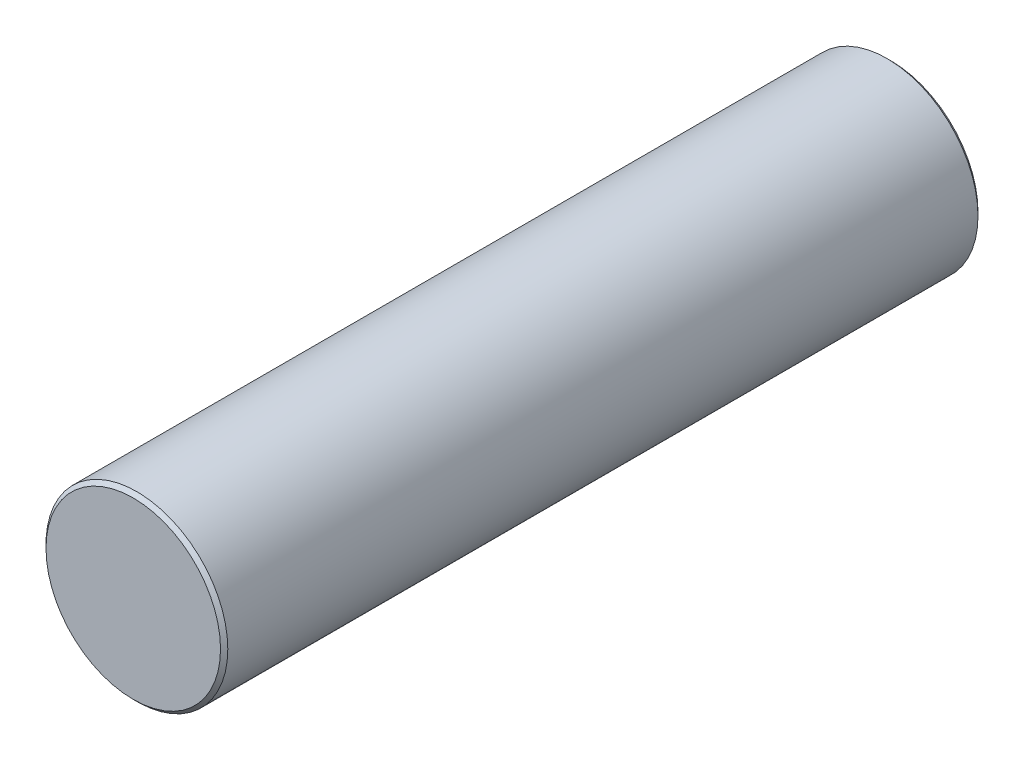
ISO-10303-21;
HEADER;
FILE_DESCRIPTION(('STEP AP214'),'2;1');
FILE_NAME('part.step','',(''),(''),'','','');
FILE_SCHEMA(('AUTOMOTIVE_DESIGN { 1 0 10303 214 1 1 1 1 }'));
ENDSEC;
DATA;
#1=APPLICATION_CONTEXT('core data for automotive mechanical design processes');
#2=APPLICATION_PROTOCOL_DEFINITION('international standard','automotive_design',2000,#1);
#3=PRODUCT_CONTEXT('',#1,'mechanical');
#4=PRODUCT('Part','Part','',(#3));
#5=PRODUCT_RELATED_PRODUCT_CATEGORY('part','',(#4));
#6=PRODUCT_DEFINITION_FORMATION('','',#4);
#7=PRODUCT_DEFINITION_CONTEXT('part definition',#1,'design');
#8=PRODUCT_DEFINITION('design','',#6,#7);
#9=PRODUCT_DEFINITION_SHAPE('','',#8);
#10=(LENGTH_UNIT() NAMED_UNIT(*) SI_UNIT(.MILLI.,.METRE.));
#11=(NAMED_UNIT(*) PLANE_ANGLE_UNIT() SI_UNIT($,.RADIAN.));
#12=(NAMED_UNIT(*) SI_UNIT($,.STERADIAN.) SOLID_ANGLE_UNIT());
#13=UNCERTAINTY_MEASURE_WITH_UNIT(LENGTH_MEASURE(1.E-05),#10,'distance_accuracy_value','');
#14=(GEOMETRIC_REPRESENTATION_CONTEXT(3) GLOBAL_UNCERTAINTY_ASSIGNED_CONTEXT((#13)) GLOBAL_UNIT_ASSIGNED_CONTEXT((#10,
#11,#12)) REPRESENTATION_CONTEXT('',''));
#15=CARTESIAN_POINT('',(0.,0.,0.));
#16=DIRECTION('',(0.,0.,1.));
#17=DIRECTION('',(1.,0.,0.));
#18=AXIS2_PLACEMENT_3D('',#15,#16,#17);
#19=CARTESIAN_POINT('',(0.,0.,12.5));
#20=DIRECTION('',(0.,0.,-1.));
#21=DIRECTION('',(-1.,0.,0.));
#22=AXIS2_PLACEMENT_3D('',#19,#20,#21);
#23=CYLINDRICAL_SURFACE('',#22,3.);
#24=CARTESIAN_POINT('',(0.,0.,-12.38));
#25=DIRECTION('',(0.,0.,1.));
#26=DIRECTION('',(1.,0.,0.));
#27=AXIS2_PLACEMENT_3D('',#24,#25,#26);
#28=CIRCLE('',#27,3.);
#29=CARTESIAN_POINT('',(3.,0.,-12.38));
#30=VERTEX_POINT('',#29);
#31=EDGE_CURVE('E53',#30,#30,#28,.T.);
#32=ORIENTED_EDGE('',*,*,#31,.T.);
#33=EDGE_LOOP('',(#32));
#34=FACE_BOUND('',#33,.T.);
#35=CARTESIAN_POINT('',(0.,0.,12.38));
#36=DIRECTION('',(0.,0.,1.));
#37=DIRECTION('',(1.,0.,0.));
#38=AXIS2_PLACEMENT_3D('',#35,#36,#37);
#39=CIRCLE('',#38,3.);
#40=CARTESIAN_POINT('',(3.,0.,12.38));
#41=VERTEX_POINT('',#40);
#42=EDGE_CURVE('E59',#41,#41,#39,.F.);
#43=ORIENTED_EDGE('',*,*,#42,.T.);
#44=EDGE_LOOP('',(#43));
#45=FACE_BOUND('',#44,.T.);
#46=ADVANCED_FACE('F39',(#34,#45),#23,.T.);
#47=CARTESIAN_POINT('',(0.,0.,12.5));
#48=DIRECTION('',(0.,0.,1.));
#49=DIRECTION('',(1.,0.,0.));
#50=AXIS2_PLACEMENT_3D('',#47,#48,#49);
#51=PLANE('',#50);
#52=CARTESIAN_POINT('',(0.,0.,12.5));
#53=DIRECTION('',(0.,0.,1.));
#54=DIRECTION('',(1.,0.,0.));
#55=AXIS2_PLACEMENT_3D('',#52,#53,#54);
#56=CIRCLE('',#55,2.88);
#57=CARTESIAN_POINT('',(2.88,0.,12.5));
#58=VERTEX_POINT('',#57);
#59=EDGE_CURVE('E10',#58,#58,#56,.T.);
#60=ORIENTED_EDGE('',*,*,#59,.T.);
#61=EDGE_LOOP('',(#60));
#62=FACE_BOUND('',#61,.T.);
#63=ADVANCED_FACE('F77',(#62),#51,.T.);
#64=CARTESIAN_POINT('',(0.,0.,-12.5));
#65=DIRECTION('',(0.,0.,1.));
#66=DIRECTION('',(1.,0.,0.));
#67=AXIS2_PLACEMENT_3D('',#64,#65,#66);
#68=PLANE('',#67);
#69=CARTESIAN_POINT('',(0.,0.,-12.5));
#70=DIRECTION('',(0.,0.,1.));
#71=DIRECTION('',(1.,0.,0.));
#72=AXIS2_PLACEMENT_3D('',#69,#70,#71);
#73=CIRCLE('',#72,2.88);
#74=CARTESIAN_POINT('',(2.88,0.,-12.5));
#75=VERTEX_POINT('',#74);
#76=EDGE_CURVE('E47',#75,#75,#73,.F.);
#77=ORIENTED_EDGE('',*,*,#76,.T.);
#78=EDGE_LOOP('',(#77));
#79=FACE_BOUND('',#78,.T.);
#80=ADVANCED_FACE('F74',(#79),#68,.F.);
#81=CARTESIAN_POINT('',(0.,0.,-12.38));
#82=DIRECTION('',(0.,0.,1.));
#83=DIRECTION('',(1.,0.,0.));
#84=AXIS2_PLACEMENT_3D('',#81,#82,#83);
#85=CONICAL_SURFACE('',#84,3.,0.785398163397434);
#86=CARTESIAN_POINT('',(2.88,0.,-12.5));
#87=CARTESIAN_POINT('',(2.88125,0.,-12.49875));
#88=CARTESIAN_POINT('',(2.8825,0.,-12.4975));
#89=CARTESIAN_POINT('',(2.885,0.,-12.495));
#90=CARTESIAN_POINT('',(2.88625,0.,-12.49375));
#91=CARTESIAN_POINT('',(2.88875,0.,-12.49125));
#92=CARTESIAN_POINT('',(2.89,0.,-12.49));
#93=CARTESIAN_POINT('',(2.8925,0.,-12.4875));
#94=CARTESIAN_POINT('',(2.89375,0.,-12.48625));
#95=CARTESIAN_POINT('',(2.89625,0.,-12.48375));
#96=CARTESIAN_POINT('',(2.8975,0.,-12.4825));
#97=CARTESIAN_POINT('',(2.9,0.,-12.48));
#98=CARTESIAN_POINT('',(2.90125,0.,-12.47875));
#99=CARTESIAN_POINT('',(2.90375,0.,-12.47625));
#100=CARTESIAN_POINT('',(2.905,0.,-12.475));
#101=CARTESIAN_POINT('',(2.9075,0.,-12.4725));
#102=CARTESIAN_POINT('',(2.90875,0.,-12.47125));
#103=CARTESIAN_POINT('',(2.91125,0.,-12.46875));
#104=CARTESIAN_POINT('',(2.9125,0.,-12.4675));
#105=CARTESIAN_POINT('',(2.915,0.,-12.465));
#106=CARTESIAN_POINT('',(2.91625,0.,-12.46375));
#107=CARTESIAN_POINT('',(2.91875,0.,-12.46125));
#108=CARTESIAN_POINT('',(2.92,0.,-12.46));
#109=CARTESIAN_POINT('',(2.9225,0.,-12.4575));
#110=CARTESIAN_POINT('',(2.92375,0.,-12.45625));
#111=CARTESIAN_POINT('',(2.92625,0.,-12.45375));
#112=CARTESIAN_POINT('',(2.9275,0.,-12.4525));
#113=CARTESIAN_POINT('',(2.93,0.,-12.45));
#114=CARTESIAN_POINT('',(2.93125,0.,-12.44875));
#115=CARTESIAN_POINT('',(2.93375,0.,-12.44625));
#116=CARTESIAN_POINT('',(2.935,0.,-12.445));
#117=CARTESIAN_POINT('',(2.9375,0.,-12.4425));
#118=CARTESIAN_POINT('',(2.93875,0.,-12.44125));
#119=CARTESIAN_POINT('',(2.94125,0.,-12.43875));
#120=CARTESIAN_POINT('',(2.9425,0.,-12.4375));
#121=CARTESIAN_POINT('',(2.945,0.,-12.435));
#122=CARTESIAN_POINT('',(2.94625,0.,-12.43375));
#123=CARTESIAN_POINT('',(2.94875,0.,-12.43125));
#124=CARTESIAN_POINT('',(2.95,0.,-12.43));
#125=CARTESIAN_POINT('',(2.9525,0.,-12.4275));
#126=CARTESIAN_POINT('',(2.95375,0.,-12.42625));
#127=CARTESIAN_POINT('',(2.95625,0.,-12.42375));
#128=CARTESIAN_POINT('',(2.9575,0.,-12.4225));
#129=CARTESIAN_POINT('',(2.96,0.,-12.42));
#130=CARTESIAN_POINT('',(2.96125,0.,-12.41875));
#131=CARTESIAN_POINT('',(2.96375,0.,-12.41625));
#132=CARTESIAN_POINT('',(2.965,0.,-12.415));
#133=CARTESIAN_POINT('',(2.9675,0.,-12.4125));
#134=CARTESIAN_POINT('',(2.96875,0.,-12.41125));
#135=CARTESIAN_POINT('',(2.97125,0.,-12.40875));
#136=CARTESIAN_POINT('',(2.9725,0.,-12.4075));
#137=CARTESIAN_POINT('',(2.975,0.,-12.405));
#138=CARTESIAN_POINT('',(2.97625,0.,-12.40375));
#139=CARTESIAN_POINT('',(2.97875,0.,-12.40125));
#140=CARTESIAN_POINT('',(2.98,0.,-12.4));
#141=CARTESIAN_POINT('',(2.9825,0.,-12.3975));
#142=CARTESIAN_POINT('',(2.98375,0.,-12.39625));
#143=CARTESIAN_POINT('',(2.98625,0.,-12.39375));
#144=CARTESIAN_POINT('',(2.9875,0.,-12.3925));
#145=CARTESIAN_POINT('',(2.99,0.,-12.39));
#146=CARTESIAN_POINT('',(2.99125,0.,-12.38875));
#147=CARTESIAN_POINT('',(2.99375,0.,-12.38625));
#148=CARTESIAN_POINT('',(2.995,0.,-12.385));
#149=CARTESIAN_POINT('',(2.9975,0.,-12.3825));
#150=CARTESIAN_POINT('',(2.99875,0.,-12.38125));
#151=CARTESIAN_POINT('',(3.,0.,-12.38));
#152=B_SPLINE_CURVE_WITH_KNOTS('',3,(#86,#87,#88,#89,#90,#91,#92,#93,#94,#95,#96,#97,#98,#99,
#100,#101,#102,#103,#104,#105,#106,#107,#108,#109,#110,#111,#112,#113,#114,#115,#116,#117,#118,
#119,#120,#121,#122,#123,#124,#125,#126,#127,#128,#129,#130,#131,#132,#133,#134,#135,#136,#137,
#138,#139,#140,#141,#142,#143,#144,#145,#146,#147,#148,#149,#150,#151),.UNSPECIFIED.,.F.,.F.,(4,
2,2,2,2,2,2,2,2,2,2,2,2,2,2,2,2,2,2,2,2,2,2,2,2,2,2,2,2,2,2,2,4),(0.,0.0053033008588992,
0.0106066017177984,0.0159099025766979,0.0212132034355971,0.0265165042944963,0.0318198051533955,
0.037123106012295,0.042426406871193,0.0477297077300921,0.0530330085889913,0.0583363094478908,
0.06363961030679,0.0689429111656892,0.0742462120245887,0.0795495128834879,0.0848528137423859,
0.0901561146012851,0.0954594154601843,0.100762716319084,0.106066017177983,0.111369318036882,
0.116672618895781,0.121975919754681,0.12727922061358,0.132582521472478,0.137885822331378,
0.143189123190277,0.148492424049176,0.153795724908075,0.159099025766975,0.164402326625874,
0.169705627484773),.UNSPECIFIED.);
#153=EDGE_CURVE('BSEAM70',#75,#30,#152,.T.);
#154=ORIENTED_EDGE('',*,*,#76,.F.);
#155=ORIENTED_EDGE('',*,*,#31,.F.);
#156=ORIENTED_EDGE('',*,*,#153,.T.);
#157=ORIENTED_EDGE('',*,*,#153,.F.);
#158=EDGE_LOOP('',(#154,#156,#155,#157));
#159=FACE_BOUND('',#158,.T.);
#160=ADVANCED_FACE('F70',(#159),#85,.T.);
#161=CARTESIAN_POINT('',(0.,0.,12.5));
#162=DIRECTION('',(0.,0.,-1.));
#163=DIRECTION('',(-1.,0.,0.));
#164=AXIS2_PLACEMENT_3D('',#161,#162,#163);
#165=CONICAL_SURFACE('',#164,2.88,0.785398163397455);
#166=ORIENTED_EDGE('',*,*,#42,.F.);
#167=EDGE_LOOP('',(#166));
#168=FACE_BOUND('',#167,.T.);
#169=ORIENTED_EDGE('',*,*,#59,.F.);
#170=EDGE_LOOP('',(#169));
#171=FACE_BOUND('',#170,.T.);
#172=ADVANCED_FACE('F41',(#168,#171),#165,.T.);
#173=CLOSED_SHELL('',(#46,#63,#80,#160,#172));
#174=MANIFOLD_SOLID_BREP('B2',#173);
#175=ADVANCED_BREP_SHAPE_REPRESENTATION('',(#18,#174),#14);
#176=SHAPE_DEFINITION_REPRESENTATION(#9,#175);
ENDSEC;
END-ISO-10303-21;
